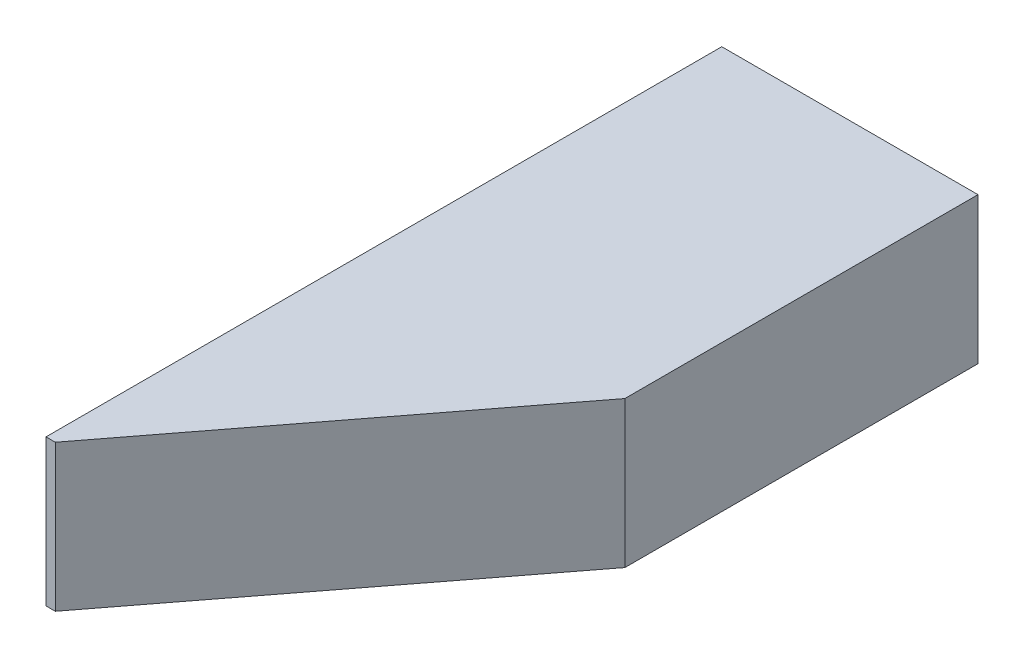
ISO-10303-21;
HEADER;
FILE_DESCRIPTION(('STEP AP214'),'2;1');
FILE_NAME('part.step','',(''),(''),'','','');
FILE_SCHEMA(('AUTOMOTIVE_DESIGN { 1 0 10303 214 1 1 1 1 }'));
ENDSEC;
DATA;
#1=APPLICATION_CONTEXT('core data for automotive mechanical design processes');
#2=APPLICATION_PROTOCOL_DEFINITION('international standard','automotive_design',2000,#1);
#3=PRODUCT_CONTEXT('',#1,'mechanical');
#4=PRODUCT('Part','Part','',(#3));
#5=PRODUCT_RELATED_PRODUCT_CATEGORY('part','',(#4));
#6=PRODUCT_DEFINITION_FORMATION('','',#4);
#7=PRODUCT_DEFINITION_CONTEXT('part definition',#1,'design');
#8=PRODUCT_DEFINITION('design','',#6,#7);
#9=PRODUCT_DEFINITION_SHAPE('','',#8);
#10=(LENGTH_UNIT() NAMED_UNIT(*) SI_UNIT(.MILLI.,.METRE.));
#11=(NAMED_UNIT(*) PLANE_ANGLE_UNIT() SI_UNIT($,.RADIAN.));
#12=(NAMED_UNIT(*) SI_UNIT($,.STERADIAN.) SOLID_ANGLE_UNIT());
#13=UNCERTAINTY_MEASURE_WITH_UNIT(LENGTH_MEASURE(1.E-05),#10,'distance_accuracy_value','');
#14=(GEOMETRIC_REPRESENTATION_CONTEXT(3) GLOBAL_UNCERTAINTY_ASSIGNED_CONTEXT((#13)) GLOBAL_UNIT_ASSIGNED_CONTEXT((#10,
#11,#12)) REPRESENTATION_CONTEXT('',''));
#15=CARTESIAN_POINT('',(0.,0.,0.));
#16=DIRECTION('',(0.,0.,1.));
#17=DIRECTION('',(1.,0.,0.));
#18=AXIS2_PLACEMENT_3D('',#15,#16,#17);
#19=CARTESIAN_POINT('',(0.,0.,122.512802726));
#20=DIRECTION('',(0.,1.,0.));
#21=DIRECTION('',(0.,0.,1.));
#22=AXIS2_PLACEMENT_3D('',#19,#20,#21);
#23=PLANE('',#22);
#24=DIRECTION('',(-1.,0.,0.));
#25=VECTOR('',#24,1.);
#26=CARTESIAN_POINT('',(15.9196024,0.,234.456585115484));
#27=LINE('',#26,#25);
#28=CARTESIAN_POINT('',(15.9196024,0.,234.456585115484));
#29=VERTEX_POINT('',#28);
#30=CARTESIAN_POINT('',(12.7,0.,234.456585115484));
#31=VERTEX_POINT('',#30);
#32=EDGE_CURVE('E115',#29,#31,#27,.T.);
#33=ORIENTED_EDGE('',*,*,#32,.T.);
#34=DIRECTION('',(0.,0.,-1.));
#35=VECTOR('',#34,1.);
#36=CARTESIAN_POINT('',(12.7,0.,234.456585115484));
#37=LINE('',#36,#35);
#38=CARTESIAN_POINT('',(12.7,0.,0.));
#39=VERTEX_POINT('',#38);
#40=EDGE_CURVE('E59',#31,#39,#37,.T.);
#41=ORIENTED_EDGE('',*,*,#40,.T.);
#42=DIRECTION('',(1.,0.,0.));
#43=VECTOR('',#42,1.);
#44=CARTESIAN_POINT('',(0.,0.,0.));
#45=LINE('',#44,#43);
#46=CARTESIAN_POINT('',(101.6,0.,0.));
#47=VERTEX_POINT('',#46);
#48=EDGE_CURVE('E85',#39,#47,#45,.T.);
#49=ORIENTED_EDGE('',*,*,#48,.T.);
#50=DIRECTION('',(0.,0.,-1.));
#51=VECTOR('',#50,1.);
#52=CARTESIAN_POINT('',(101.6,0.,122.512802726));
#53=LINE('',#52,#51);
#54=CARTESIAN_POINT('',(101.6,0.,122.512802726));
#55=VERTEX_POINT('',#54);
#56=EDGE_CURVE('E11',#55,#47,#53,.T.);
#57=ORIENTED_EDGE('',*,*,#56,.F.);
#58=DIRECTION('',(-0.607791710969148,0.,0.794096490407303));
#59=VECTOR('',#58,1.);
#60=CARTESIAN_POINT('',(101.6,0.,122.512802726));
#61=LINE('',#60,#59);
#62=EDGE_CURVE('E109',#55,#29,#61,.T.);
#63=ORIENTED_EDGE('',*,*,#62,.T.);
#64=EDGE_LOOP('',(#33,#41,#49,#57,#63));
#65=FACE_BOUND('',#64,.T.);
#66=ADVANCED_FACE('F44',(#65),#23,.F.);
#67=CARTESIAN_POINT('',(101.6,0.,122.512802726));
#68=DIRECTION('',(-1.,0.,0.));
#69=DIRECTION('',(0.,0.,1.));
#70=AXIS2_PLACEMENT_3D('',#67,#68,#69);
#71=PLANE('',#70);
#72=DIRECTION('',(0.,1.,0.));
#73=VECTOR('',#72,1.);
#74=CARTESIAN_POINT('',(101.6,0.,0.));
#75=LINE('',#74,#73);
#76=CARTESIAN_POINT('',(101.6,50.8,0.));
#77=VERTEX_POINT('',#76);
#78=EDGE_CURVE('E78',#47,#77,#75,.T.);
#79=ORIENTED_EDGE('',*,*,#78,.T.);
#80=DIRECTION('',(0.,0.,-1.));
#81=VECTOR('',#80,1.);
#82=CARTESIAN_POINT('',(101.6,50.8,122.512802726));
#83=LINE('',#82,#81);
#84=CARTESIAN_POINT('',(101.6,50.8,122.512802726));
#85=VERTEX_POINT('',#84);
#86=EDGE_CURVE('E52',#85,#77,#83,.T.);
#87=ORIENTED_EDGE('',*,*,#86,.F.);
#88=DIRECTION('',(0.,1.,0.));
#89=VECTOR('',#88,1.);
#90=CARTESIAN_POINT('',(101.6,0.,122.512802726));
#91=LINE('',#90,#89);
#92=EDGE_CURVE('E97',#55,#85,#91,.T.);
#93=ORIENTED_EDGE('',*,*,#92,.F.);
#94=ORIENTED_EDGE('',*,*,#56,.T.);
#95=EDGE_LOOP('',(#79,#87,#93,#94));
#96=FACE_BOUND('',#95,.T.);
#97=ADVANCED_FACE('F79',(#96),#71,.F.);
#98=CARTESIAN_POINT('',(0.,50.8,122.512802726));
#99=DIRECTION('',(0.,-1.,0.));
#100=DIRECTION('',(0.,0.,-1.));
#101=AXIS2_PLACEMENT_3D('',#98,#99,#100);
#102=PLANE('',#101);
#103=DIRECTION('',(-1.,0.,0.));
#104=VECTOR('',#103,1.);
#105=CARTESIAN_POINT('',(0.,50.8,0.));
#106=LINE('',#105,#104);
#107=CARTESIAN_POINT('',(12.7,50.8,0.));
#108=VERTEX_POINT('',#107);
#109=EDGE_CURVE('E84',#77,#108,#106,.T.);
#110=ORIENTED_EDGE('',*,*,#109,.T.);
#111=DIRECTION('',(0.,0.,-1.));
#112=VECTOR('',#111,1.);
#113=CARTESIAN_POINT('',(12.7,50.8,234.456585115484));
#114=LINE('',#113,#112);
#115=CARTESIAN_POINT('',(12.7,50.8,234.456585115484));
#116=VERTEX_POINT('',#115);
#117=EDGE_CURVE('E132',#116,#108,#114,.T.);
#118=ORIENTED_EDGE('',*,*,#117,.F.);
#119=DIRECTION('',(1.,0.,0.));
#120=VECTOR('',#119,1.);
#121=CARTESIAN_POINT('',(15.9196024,50.8,234.456585115484));
#122=LINE('',#121,#120);
#123=CARTESIAN_POINT('',(15.9196024,50.8,234.456585115484));
#124=VERTEX_POINT('',#123);
#125=EDGE_CURVE('E118',#116,#124,#122,.T.);
#126=ORIENTED_EDGE('',*,*,#125,.T.);
#127=DIRECTION('',(0.607791710969148,0.,-0.794096490407303));
#128=VECTOR('',#127,1.);
#129=CARTESIAN_POINT('',(101.6,50.8,122.512802726));
#130=LINE('',#129,#128);
#131=EDGE_CURVE('E95',#124,#85,#130,.T.);
#132=ORIENTED_EDGE('',*,*,#131,.T.);
#133=ORIENTED_EDGE('',*,*,#86,.T.);
#134=EDGE_LOOP('',(#110,#118,#126,#132,#133));
#135=FACE_BOUND('',#134,.T.);
#136=ADVANCED_FACE('F90',(#135),#102,.F.);
#137=CARTESIAN_POINT('',(0.,0.,0.));
#138=DIRECTION('',(0.,0.,-1.));
#139=DIRECTION('',(-1.,0.,0.));
#140=AXIS2_PLACEMENT_3D('',#137,#138,#139);
#141=PLANE('',#140);
#142=DIRECTION('',(0.,1.,0.));
#143=VECTOR('',#142,1.);
#144=CARTESIAN_POINT('',(12.7,0.,0.));
#145=LINE('',#144,#143);
#146=EDGE_CURVE('E100',#39,#108,#145,.T.);
#147=ORIENTED_EDGE('',*,*,#146,.T.);
#148=ORIENTED_EDGE('',*,*,#109,.F.);
#149=ORIENTED_EDGE('',*,*,#78,.F.);
#150=ORIENTED_EDGE('',*,*,#48,.F.);
#151=EDGE_LOOP('',(#147,#148,#149,#150));
#152=FACE_BOUND('',#151,.T.);
#153=ADVANCED_FACE('F99',(#152),#141,.T.);
#154=CARTESIAN_POINT('',(101.6,-151.175296975611,122.512802726));
#155=DIRECTION('',(0.794096490407303,0.,0.607791710969148));
#156=DIRECTION('',(0.607791710969148,0.,-0.794096490407303));
#157=AXIS2_PLACEMENT_3D('',#154,#155,#156);
#158=PLANE('',#157);
#159=ORIENTED_EDGE('',*,*,#62,.F.);
#160=ORIENTED_EDGE('',*,*,#92,.T.);
#161=ORIENTED_EDGE('',*,*,#131,.F.);
#162=DIRECTION('',(0.,1.,0.));
#163=VECTOR('',#162,1.);
#164=CARTESIAN_POINT('',(15.9196024,-151.175296975611,234.456585115484));
#165=LINE('',#164,#163);
#166=EDGE_CURVE('E111',#29,#124,#165,.T.);
#167=ORIENTED_EDGE('',*,*,#166,.F.);
#168=EDGE_LOOP('',(#159,#160,#161,#167));
#169=FACE_BOUND('',#168,.T.);
#170=ADVANCED_FACE('F154',(#169),#158,.T.);
#171=CARTESIAN_POINT('',(15.9196024,-151.175296975611,234.456585115484));
#172=DIRECTION('',(0.,0.,1.));
#173=DIRECTION('',(1.,0.,0.));
#174=AXIS2_PLACEMENT_3D('',#171,#172,#173);
#175=PLANE('',#174);
#176=DIRECTION('',(0.,1.,0.));
#177=VECTOR('',#176,1.);
#178=CARTESIAN_POINT('',(12.7,0.,234.456585115484));
#179=LINE('',#178,#177);
#180=EDGE_CURVE('E127',#31,#116,#179,.T.);
#181=ORIENTED_EDGE('',*,*,#180,.F.);
#182=ORIENTED_EDGE('',*,*,#32,.F.);
#183=ORIENTED_EDGE('',*,*,#166,.T.);
#184=ORIENTED_EDGE('',*,*,#125,.F.);
#185=EDGE_LOOP('',(#181,#182,#183,#184));
#186=FACE_BOUND('',#185,.T.);
#187=ADVANCED_FACE('F152',(#186),#175,.T.);
#188=CARTESIAN_POINT('',(12.7,0.,234.456585115484));
#189=DIRECTION('',(1.,0.,0.));
#190=DIRECTION('',(0.,0.,-1.));
#191=AXIS2_PLACEMENT_3D('',#188,#189,#190);
#192=PLANE('',#191);
#193=ORIENTED_EDGE('',*,*,#117,.T.);
#194=ORIENTED_EDGE('',*,*,#146,.F.);
#195=ORIENTED_EDGE('',*,*,#40,.F.);
#196=ORIENTED_EDGE('',*,*,#180,.T.);
#197=EDGE_LOOP('',(#193,#194,#195,#196));
#198=FACE_BOUND('',#197,.T.);
#199=ADVANCED_FACE('F161',(#198),#192,.F.);
#200=CLOSED_SHELL('',(#66,#97,#136,#153,#170,#187,#199));
#201=MANIFOLD_SOLID_BREP('B2',#200);
#202=ADVANCED_BREP_SHAPE_REPRESENTATION('',(#18,#201),#14);
#203=SHAPE_DEFINITION_REPRESENTATION(#9,#202);
ENDSEC;
END-ISO-10303-21;
